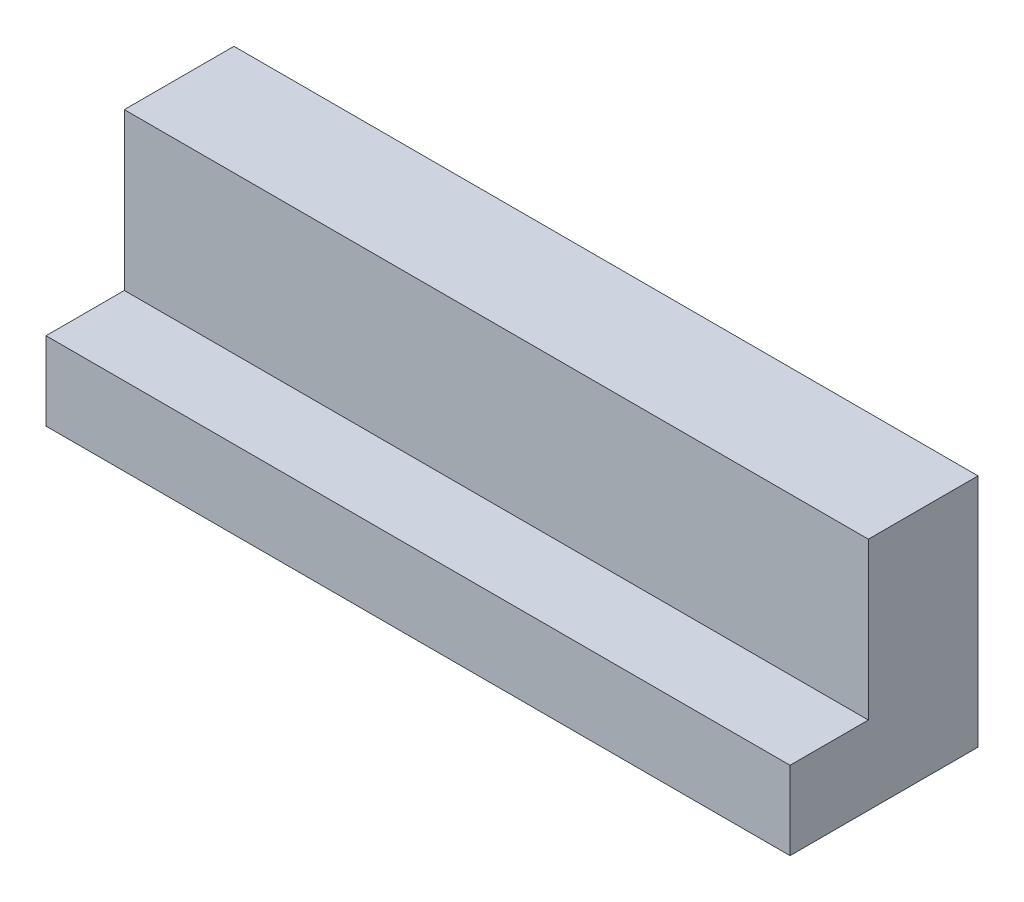
ISO-10303-21;
HEADER;
FILE_DESCRIPTION(('STEP AP214'),'2;1');
FILE_NAME('part.step','',(''),(''),'','','');
FILE_SCHEMA(('AUTOMOTIVE_DESIGN { 1 0 10303 214 1 1 1 1 }'));
ENDSEC;
DATA;
#1=APPLICATION_CONTEXT('core data for automotive mechanical design processes');
#2=APPLICATION_PROTOCOL_DEFINITION('international standard','automotive_design',2000,#1);
#3=PRODUCT_CONTEXT('',#1,'mechanical');
#4=PRODUCT('Part','Part','',(#3));
#5=PRODUCT_RELATED_PRODUCT_CATEGORY('part','',(#4));
#6=PRODUCT_DEFINITION_FORMATION('','',#4);
#7=PRODUCT_DEFINITION_CONTEXT('part definition',#1,'design');
#8=PRODUCT_DEFINITION('design','',#6,#7);
#9=PRODUCT_DEFINITION_SHAPE('','',#8);
#10=(LENGTH_UNIT() NAMED_UNIT(*) SI_UNIT(.MILLI.,.METRE.));
#11=(NAMED_UNIT(*) PLANE_ANGLE_UNIT() SI_UNIT($,.RADIAN.));
#12=(NAMED_UNIT(*) SI_UNIT($,.STERADIAN.) SOLID_ANGLE_UNIT());
#13=UNCERTAINTY_MEASURE_WITH_UNIT(LENGTH_MEASURE(1.E-05),#10,'distance_accuracy_value','');
#14=(GEOMETRIC_REPRESENTATION_CONTEXT(3) GLOBAL_UNCERTAINTY_ASSIGNED_CONTEXT((#13)) GLOBAL_UNIT_ASSIGNED_CONTEXT((#10,
#11,#12)) REPRESENTATION_CONTEXT('',''));
#15=CARTESIAN_POINT('',(0.,0.,0.));
#16=DIRECTION('',(0.,0.,1.));
#17=DIRECTION('',(1.,0.,0.));
#18=AXIS2_PLACEMENT_3D('',#15,#16,#17);
#19=CARTESIAN_POINT('',(39.7824296403445,-1.69999999999997,2.8));
#20=DIRECTION('',(-1.,0.,0.));
#21=DIRECTION('',(0.,0.,1.));
#22=AXIS2_PLACEMENT_3D('',#19,#20,#21);
#23=PLANE('',#22);
#24=DIRECTION('',(0.,1.,0.));
#25=VECTOR('',#24,1.);
#26=CARTESIAN_POINT('',(39.7824296403445,-1.69999999999997,0.));
#27=LINE('',#26,#25);
#28=CARTESIAN_POINT('',(39.7824296403445,-1.69999999999997,0.));
#29=VERTEX_POINT('',#28);
#30=CARTESIAN_POINT('',(39.7824296403445,4.30000000000003,0.));
#31=VERTEX_POINT('',#30);
#32=EDGE_CURVE('E91',#29,#31,#27,.T.);
#33=ORIENTED_EDGE('',*,*,#32,.T.);
#34=DIRECTION('',(0.,0.,-1.));
#35=VECTOR('',#34,1.);
#36=CARTESIAN_POINT('',(39.7824296403445,4.30000000000003,2.8));
#37=LINE('',#36,#35);
#38=CARTESIAN_POINT('',(39.7824296403445,4.30000000000003,2.8));
#39=VERTEX_POINT('',#38);
#40=EDGE_CURVE('E11',#39,#31,#37,.T.);
#41=ORIENTED_EDGE('',*,*,#40,.F.);
#42=DIRECTION('',(0.,1.,0.));
#43=VECTOR('',#42,1.);
#44=CARTESIAN_POINT('',(39.7824296403445,-1.69999999999997,2.8));
#45=LINE('',#44,#43);
#46=CARTESIAN_POINT('',(39.7824296403445,0.300000000000026,2.8));
#47=VERTEX_POINT('',#46);
#48=EDGE_CURVE('E84',#47,#39,#45,.T.);
#49=ORIENTED_EDGE('',*,*,#48,.F.);
#50=DIRECTION('',(0.,0.,-1.));
#51=VECTOR('',#50,1.);
#52=CARTESIAN_POINT('',(39.7824296403445,0.300000000000028,4.8));
#53=LINE('',#52,#51);
#54=CARTESIAN_POINT('',(39.7824296403445,0.300000000000028,4.8));
#55=VERTEX_POINT('',#54);
#56=EDGE_CURVE('E99',#55,#47,#53,.T.);
#57=ORIENTED_EDGE('',*,*,#56,.F.);
#58=DIRECTION('',(0.,1.,0.));
#59=VECTOR('',#58,1.);
#60=CARTESIAN_POINT('',(39.7824296403445,-1.69999999999997,4.8));
#61=LINE('',#60,#59);
#62=CARTESIAN_POINT('',(39.7824296403445,-1.69999999999997,4.8));
#63=VERTEX_POINT('',#62);
#64=EDGE_CURVE('E94',#63,#55,#61,.T.);
#65=ORIENTED_EDGE('',*,*,#64,.F.);
#66=DIRECTION('',(0.,0.,-1.));
#67=VECTOR('',#66,1.);
#68=CARTESIAN_POINT('',(39.7824296403445,-1.69999999999997,2.8));
#69=LINE('',#68,#67);
#70=EDGE_CURVE('E77',#63,#29,#69,.T.);
#71=ORIENTED_EDGE('',*,*,#70,.T.);
#72=EDGE_LOOP('',(#33,#41,#49,#57,#65,#71));
#73=FACE_BOUND('',#72,.T.);
#74=ADVANCED_FACE('F33',(#73),#23,.F.);
#75=CARTESIAN_POINT('',(39.7824296403445,4.30000000000003,2.8));
#76=DIRECTION('',(0.,-1.,0.));
#77=DIRECTION('',(1.,0.,0.));
#78=AXIS2_PLACEMENT_3D('',#75,#76,#77);
#79=PLANE('',#78);
#80=DIRECTION('',(-1.,0.,0.));
#81=VECTOR('',#80,1.);
#82=CARTESIAN_POINT('',(39.7824296403445,4.30000000000003,0.));
#83=LINE('',#82,#81);
#84=CARTESIAN_POINT('',(20.7824296403445,4.30000000000003,0.));
#85=VERTEX_POINT('',#84);
#86=EDGE_CURVE('E98',#31,#85,#83,.T.);
#87=ORIENTED_EDGE('',*,*,#86,.T.);
#88=DIRECTION('',(0.,0.,-1.));
#89=VECTOR('',#88,1.);
#90=CARTESIAN_POINT('',(20.7824296403445,4.30000000000003,2.8));
#91=LINE('',#90,#89);
#92=CARTESIAN_POINT('',(20.7824296403445,4.30000000000003,2.8));
#93=VERTEX_POINT('',#92);
#94=EDGE_CURVE('E40',#93,#85,#91,.T.);
#95=ORIENTED_EDGE('',*,*,#94,.F.);
#96=DIRECTION('',(-1.,0.,0.));
#97=VECTOR('',#96,1.);
#98=CARTESIAN_POINT('',(39.7824296403445,4.30000000000003,2.8));
#99=LINE('',#98,#97);
#100=EDGE_CURVE('E53',#39,#93,#99,.T.);
#101=ORIENTED_EDGE('',*,*,#100,.F.);
#102=ORIENTED_EDGE('',*,*,#40,.T.);
#103=EDGE_LOOP('',(#87,#95,#101,#102));
#104=FACE_BOUND('',#103,.T.);
#105=ADVANCED_FACE('F115',(#104),#79,.F.);
#106=CARTESIAN_POINT('',(20.7824296403445,-1.69999999999997,2.8));
#107=DIRECTION('',(1.,0.,0.));
#108=DIRECTION('',(0.,0.,-1.));
#109=AXIS2_PLACEMENT_3D('',#106,#107,#108);
#110=PLANE('',#109);
#111=DIRECTION('',(0.,-1.,0.));
#112=VECTOR('',#111,1.);
#113=CARTESIAN_POINT('',(20.7824296403445,-1.69999999999997,0.));
#114=LINE('',#113,#112);
#115=CARTESIAN_POINT('',(20.7824296403445,-1.69999999999997,0.));
#116=VERTEX_POINT('',#115);
#117=EDGE_CURVE('E85',#85,#116,#114,.T.);
#118=ORIENTED_EDGE('',*,*,#117,.T.);
#119=DIRECTION('',(0.,0.,-1.));
#120=VECTOR('',#119,1.);
#121=CARTESIAN_POINT('',(20.7824296403445,-1.69999999999997,2.8));
#122=LINE('',#121,#120);
#123=CARTESIAN_POINT('',(20.7824296403445,-1.69999999999997,4.8));
#124=VERTEX_POINT('',#123);
#125=EDGE_CURVE('E80',#124,#116,#122,.T.);
#126=ORIENTED_EDGE('',*,*,#125,.F.);
#127=DIRECTION('',(0.,-1.,0.));
#128=VECTOR('',#127,1.);
#129=CARTESIAN_POINT('',(20.7824296403445,-1.69999999999997,4.8));
#130=LINE('',#129,#128);
#131=CARTESIAN_POINT('',(20.7824296403445,0.300000000000025,4.8));
#132=VERTEX_POINT('',#131);
#133=EDGE_CURVE('E130',#132,#124,#130,.T.);
#134=ORIENTED_EDGE('',*,*,#133,.F.);
#135=DIRECTION('',(0.,0.,-1.));
#136=VECTOR('',#135,1.);
#137=CARTESIAN_POINT('',(20.7824296403445,0.300000000000025,4.8));
#138=LINE('',#137,#136);
#139=CARTESIAN_POINT('',(20.7824296403445,0.300000000000025,2.8));
#140=VERTEX_POINT('',#139);
#141=EDGE_CURVE('E103',#132,#140,#138,.T.);
#142=ORIENTED_EDGE('',*,*,#141,.T.);
#143=DIRECTION('',(0.,-1.,0.));
#144=VECTOR('',#143,1.);
#145=CARTESIAN_POINT('',(20.7824296403445,-1.69999999999997,2.8));
#146=LINE('',#145,#144);
#147=EDGE_CURVE('E95',#93,#140,#146,.T.);
#148=ORIENTED_EDGE('',*,*,#147,.F.);
#149=ORIENTED_EDGE('',*,*,#94,.T.);
#150=EDGE_LOOP('',(#118,#126,#134,#142,#148,#149));
#151=FACE_BOUND('',#150,.T.);
#152=ADVANCED_FACE('F112',(#151),#110,.F.);
#153=CARTESIAN_POINT('',(39.7824296403445,-1.69999999999997,2.8));
#154=DIRECTION('',(0.,1.,0.));
#155=DIRECTION('',(-1.,0.,0.));
#156=AXIS2_PLACEMENT_3D('',#153,#154,#155);
#157=PLANE('',#156);
#158=DIRECTION('',(1.,0.,0.));
#159=VECTOR('',#158,1.);
#160=CARTESIAN_POINT('',(39.7824296403445,-1.69999999999997,0.));
#161=LINE('',#160,#159);
#162=EDGE_CURVE('E73',#116,#29,#161,.T.);
#163=ORIENTED_EDGE('',*,*,#162,.T.);
#164=ORIENTED_EDGE('',*,*,#70,.F.);
#165=DIRECTION('',(1.,0.,0.));
#166=VECTOR('',#165,1.);
#167=CARTESIAN_POINT('',(39.7824296403445,-1.69999999999997,4.8));
#168=LINE('',#167,#166);
#169=EDGE_CURVE('E133',#124,#63,#168,.T.);
#170=ORIENTED_EDGE('',*,*,#169,.F.);
#171=ORIENTED_EDGE('',*,*,#125,.T.);
#172=EDGE_LOOP('',(#163,#164,#170,#171));
#173=FACE_BOUND('',#172,.T.);
#174=ADVANCED_FACE('F75',(#173),#157,.F.);
#175=CARTESIAN_POINT('',(0.,0.,2.8));
#176=DIRECTION('',(0.,0.,1.));
#177=DIRECTION('',(1.,0.,0.));
#178=AXIS2_PLACEMENT_3D('',#175,#176,#177);
#179=PLANE('',#178);
#180=DIRECTION('',(-1.,0.,0.));
#181=VECTOR('',#180,1.);
#182=CARTESIAN_POINT('',(39.7824296403445,0.300000000000028,2.8));
#183=LINE('',#182,#181);
#184=EDGE_CURVE('E47',#47,#140,#183,.T.);
#185=ORIENTED_EDGE('',*,*,#184,.F.);
#186=ORIENTED_EDGE('',*,*,#48,.T.);
#187=ORIENTED_EDGE('',*,*,#100,.T.);
#188=ORIENTED_EDGE('',*,*,#147,.T.);
#189=EDGE_LOOP('',(#185,#186,#187,#188));
#190=FACE_BOUND('',#189,.T.);
#191=ADVANCED_FACE('F139',(#190),#179,.T.);
#192=CARTESIAN_POINT('',(0.,0.,0.));
#193=DIRECTION('',(0.,0.,1.));
#194=DIRECTION('',(1.,0.,0.));
#195=AXIS2_PLACEMENT_3D('',#192,#193,#194);
#196=PLANE('',#195);
#197=ORIENTED_EDGE('',*,*,#32,.F.);
#198=ORIENTED_EDGE('',*,*,#162,.F.);
#199=ORIENTED_EDGE('',*,*,#117,.F.);
#200=ORIENTED_EDGE('',*,*,#86,.F.);
#201=EDGE_LOOP('',(#197,#198,#199,#200));
#202=FACE_BOUND('',#201,.T.);
#203=ADVANCED_FACE('F97',(#202),#196,.F.);
#204=CARTESIAN_POINT('',(39.7824296403445,0.300000000000028,4.8));
#205=DIRECTION('',(0.,-1.,0.));
#206=DIRECTION('',(1.,0.,0.));
#207=AXIS2_PLACEMENT_3D('',#204,#205,#206);
#208=PLANE('',#207);
#209=ORIENTED_EDGE('',*,*,#184,.T.);
#210=ORIENTED_EDGE('',*,*,#141,.F.);
#211=DIRECTION('',(-1.,0.,0.));
#212=VECTOR('',#211,1.);
#213=CARTESIAN_POINT('',(39.7824296403445,0.300000000000028,4.8));
#214=LINE('',#213,#212);
#215=EDGE_CURVE('E124',#55,#132,#214,.T.);
#216=ORIENTED_EDGE('',*,*,#215,.F.);
#217=ORIENTED_EDGE('',*,*,#56,.T.);
#218=EDGE_LOOP('',(#209,#210,#216,#217));
#219=FACE_BOUND('',#218,.T.);
#220=ADVANCED_FACE('F120',(#219),#208,.F.);
#221=CARTESIAN_POINT('',(0.,0.,4.8));
#222=DIRECTION('',(0.,0.,1.));
#223=DIRECTION('',(1.,0.,0.));
#224=AXIS2_PLACEMENT_3D('',#221,#222,#223);
#225=PLANE('',#224);
#226=ORIENTED_EDGE('',*,*,#64,.T.);
#227=ORIENTED_EDGE('',*,*,#215,.T.);
#228=ORIENTED_EDGE('',*,*,#133,.T.);
#229=ORIENTED_EDGE('',*,*,#169,.T.);
#230=EDGE_LOOP('',(#226,#227,#228,#229));
#231=FACE_BOUND('',#230,.T.);
#232=ADVANCED_FACE('F132',(#231),#225,.T.);
#233=CLOSED_SHELL('',(#74,#105,#152,#174,#191,#203,#220,#232));
#234=MANIFOLD_SOLID_BREP('B2',#233);
#235=ADVANCED_BREP_SHAPE_REPRESENTATION('',(#18,#234),#14);
#236=SHAPE_DEFINITION_REPRESENTATION(#9,#235);
ENDSEC;
END-ISO-10303-21;
